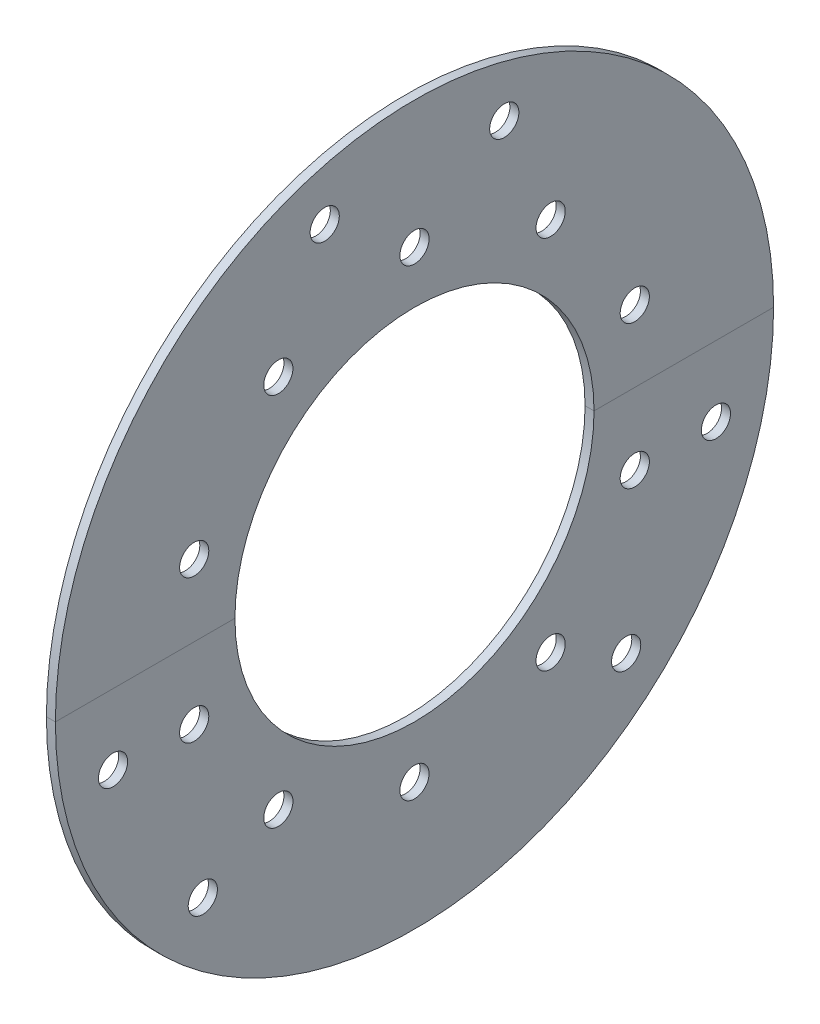
ISO-10303-21;
HEADER;
FILE_DESCRIPTION(('STEP AP214'),'2;1');
FILE_NAME('part.step','',(''),(''),'','','');
FILE_SCHEMA(('AUTOMOTIVE_DESIGN { 1 0 10303 214 1 1 1 1 }'));
ENDSEC;
DATA;
#1=APPLICATION_CONTEXT('core data for automotive mechanical design processes');
#2=APPLICATION_PROTOCOL_DEFINITION('international standard','automotive_design',2000,#1);
#3=PRODUCT_CONTEXT('',#1,'mechanical');
#4=PRODUCT('Part','Part','',(#3));
#5=PRODUCT_RELATED_PRODUCT_CATEGORY('part','',(#4));
#6=PRODUCT_DEFINITION_FORMATION('','',#4);
#7=PRODUCT_DEFINITION_CONTEXT('part definition',#1,'design');
#8=PRODUCT_DEFINITION('design','',#6,#7);
#9=PRODUCT_DEFINITION_SHAPE('','',#8);
#10=(LENGTH_UNIT() NAMED_UNIT(*) SI_UNIT(.MILLI.,.METRE.));
#11=(NAMED_UNIT(*) PLANE_ANGLE_UNIT() SI_UNIT($,.RADIAN.));
#12=(NAMED_UNIT(*) SI_UNIT($,.STERADIAN.) SOLID_ANGLE_UNIT());
#13=UNCERTAINTY_MEASURE_WITH_UNIT(LENGTH_MEASURE(1.E-05),#10,'distance_accuracy_value','');
#14=(GEOMETRIC_REPRESENTATION_CONTEXT(3) GLOBAL_UNCERTAINTY_ASSIGNED_CONTEXT((#13)) GLOBAL_UNIT_ASSIGNED_CONTEXT((#10,
#11,#12)) REPRESENTATION_CONTEXT('',''));
#15=CARTESIAN_POINT('',(0.,0.,0.));
#16=DIRECTION('',(0.,0.,1.));
#17=DIRECTION('',(1.,0.,0.));
#18=AXIS2_PLACEMENT_3D('',#15,#16,#17);
#19=CARTESIAN_POINT('',(0.,0.,0.));
#20=DIRECTION('',(0.,1.,0.));
#21=DIRECTION('',(0.,0.,1.));
#22=AXIS2_PLACEMENT_3D('',#19,#20,#21);
#23=PLANE('',#22);
#24=DIRECTION('',(0.,0.,1.));
#25=VECTOR('',#24,1.);
#26=CARTESIAN_POINT('',(2.,0.,0.));
#27=LINE('',#26,#25);
#28=CARTESIAN_POINT('',(2.,0.,-80.));
#29=VERTEX_POINT('',#28);
#30=CARTESIAN_POINT('',(2.,0.,-40.));
#31=VERTEX_POINT('',#30);
#32=EDGE_CURVE('E91',#29,#31,#27,.T.);
#33=ORIENTED_EDGE('',*,*,#32,.F.);
#34=DIRECTION('',(-1.,0.,0.));
#35=VECTOR('',#34,1.);
#36=CARTESIAN_POINT('',(2.,0.,-80.));
#37=LINE('',#36,#35);
#38=CARTESIAN_POINT('',(0.,0.,-80.));
#39=VERTEX_POINT('',#38);
#40=EDGE_CURVE('E100',#29,#39,#37,.T.);
#41=ORIENTED_EDGE('',*,*,#40,.T.);
#42=DIRECTION('',(0.,0.,1.));
#43=VECTOR('',#42,1.);
#44=CARTESIAN_POINT('',(0.,0.,0.));
#45=LINE('',#44,#43);
#46=CARTESIAN_POINT('',(0.,0.,-40.));
#47=VERTEX_POINT('',#46);
#48=EDGE_CURVE('E101',#39,#47,#45,.T.);
#49=ORIENTED_EDGE('',*,*,#48,.T.);
#50=DIRECTION('',(-1.,0.,0.));
#51=VECTOR('',#50,1.);
#52=CARTESIAN_POINT('',(2.,0.,-40.));
#53=LINE('',#52,#51);
#54=EDGE_CURVE('E61',#31,#47,#53,.T.);
#55=ORIENTED_EDGE('',*,*,#54,.F.);
#56=EDGE_LOOP('',(#33,#41,#49,#55));
#57=FACE_BOUND('',#56,.T.);
#58=ADVANCED_FACE('F44',(#57),#23,.T.);
#59=CARTESIAN_POINT('',(0.,0.,40.));
#60=VERTEX_POINT('',#59);
#61=CARTESIAN_POINT('',(0.,0.,80.));
#62=VERTEX_POINT('',#61);
#63=EDGE_CURVE('E105',#60,#62,#45,.T.);
#64=ORIENTED_EDGE('',*,*,#63,.T.);
#65=DIRECTION('',(-1.,0.,0.));
#66=VECTOR('',#65,1.);
#67=CARTESIAN_POINT('',(2.,0.,80.));
#68=LINE('',#67,#66);
#69=CARTESIAN_POINT('',(2.,0.,80.));
#70=VERTEX_POINT('',#69);
#71=EDGE_CURVE('E106',#62,#70,#68,.F.);
#72=ORIENTED_EDGE('',*,*,#71,.T.);
#73=CARTESIAN_POINT('',(2.,0.,40.));
#74=VERTEX_POINT('',#73);
#75=EDGE_CURVE('E92',#74,#70,#27,.T.);
#76=ORIENTED_EDGE('',*,*,#75,.F.);
#77=DIRECTION('',(-1.,0.,0.));
#78=VECTOR('',#77,1.);
#79=CARTESIAN_POINT('',(2.,0.,40.));
#80=LINE('',#79,#78);
#81=EDGE_CURVE('E69',#60,#74,#80,.F.);
#82=ORIENTED_EDGE('',*,*,#81,.F.);
#83=EDGE_LOOP('',(#64,#72,#76,#82));
#84=FACE_BOUND('',#83,.T.);
#85=ADVANCED_FACE('F172',(#84),#23,.T.);
#86=CARTESIAN_POINT('',(2.,-15.9452769097473,-49.0745162408299));
#87=DIRECTION('',(-1.,0.,0.));
#88=DIRECTION('',(0.,0.,1.));
#89=AXIS2_PLACEMENT_3D('',#86,#87,#88);
#90=CYLINDRICAL_SURFACE('',#89,3.25000000000001);
#91=CARTESIAN_POINT('',(2.,-15.9452769097473,-49.0745162408299));
#92=DIRECTION('',(1.,0.,0.));
#93=DIRECTION('',(0.,0.,-1.));
#94=AXIS2_PLACEMENT_3D('',#91,#92,#93);
#95=CIRCLE('',#94,3.25000000000001);
#96=CARTESIAN_POINT('',(2.,-15.9452769097473,-52.3245162408299));
#97=VERTEX_POINT('',#96);
#98=EDGE_CURVE('E114',#97,#97,#95,.T.);
#99=ORIENTED_EDGE('',*,*,#98,.T.);
#100=EDGE_LOOP('',(#99));
#101=FACE_BOUND('',#100,.T.);
#102=CARTESIAN_POINT('',(0.,-15.9452769097473,-49.0745162408299));
#103=DIRECTION('',(1.,0.,0.));
#104=DIRECTION('',(0.,0.,-1.));
#105=AXIS2_PLACEMENT_3D('',#102,#103,#104);
#106=CIRCLE('',#105,3.25000000000001);
#107=CARTESIAN_POINT('',(0.,-15.9452769097473,-52.3245162408299));
#108=VERTEX_POINT('',#107);
#109=EDGE_CURVE('E118',#108,#108,#106,.T.);
#110=ORIENTED_EDGE('',*,*,#109,.F.);
#111=EDGE_LOOP('',(#110));
#112=FACE_BOUND('',#111,.T.);
#113=ADVANCED_FACE('F174',(#101,#112),#90,.F.);
#114=CARTESIAN_POINT('',(2.,-41.7452769097473,-30.3297190182916));
#115=DIRECTION('',(-1.,0.,0.));
#116=DIRECTION('',(0.,0.,1.));
#117=AXIS2_PLACEMENT_3D('',#114,#115,#116);
#118=CYLINDRICAL_SURFACE('',#117,3.24999999999999);
#119=CARTESIAN_POINT('',(2.,-41.7452769097473,-30.3297190182916));
#120=DIRECTION('',(1.,0.,0.));
#121=DIRECTION('',(0.,0.,-1.));
#122=AXIS2_PLACEMENT_3D('',#119,#120,#121);
#123=CIRCLE('',#122,3.24999999999999);
#124=CARTESIAN_POINT('',(2.,-41.7452769097473,-33.5797190182916));
#125=VERTEX_POINT('',#124);
#126=EDGE_CURVE('E123',#125,#125,#123,.T.);
#127=ORIENTED_EDGE('',*,*,#126,.T.);
#128=EDGE_LOOP('',(#127));
#129=FACE_BOUND('',#128,.T.);
#130=CARTESIAN_POINT('',(0.,-41.7452769097473,-30.3297190182916));
#131=DIRECTION('',(1.,0.,0.));
#132=DIRECTION('',(0.,0.,-1.));
#133=AXIS2_PLACEMENT_3D('',#130,#131,#132);
#134=CIRCLE('',#133,3.24999999999999);
#135=CARTESIAN_POINT('',(0.,-41.7452769097473,-33.5797190182916));
#136=VERTEX_POINT('',#135);
#137=EDGE_CURVE('E126',#136,#136,#134,.T.);
#138=ORIENTED_EDGE('',*,*,#137,.F.);
#139=EDGE_LOOP('',(#138));
#140=FACE_BOUND('',#139,.T.);
#141=ADVANCED_FACE('F180',(#129,#140),#118,.F.);
#142=CARTESIAN_POINT('',(2.,-51.6,0.));
#143=DIRECTION('',(-1.,0.,0.));
#144=DIRECTION('',(0.,0.,1.));
#145=AXIS2_PLACEMENT_3D('',#142,#143,#144);
#146=CYLINDRICAL_SURFACE('',#145,3.25000000000001);
#147=CARTESIAN_POINT('',(2.,-51.6,0.));
#148=DIRECTION('',(1.,0.,0.));
#149=DIRECTION('',(0.,0.,-1.));
#150=AXIS2_PLACEMENT_3D('',#147,#148,#149);
#151=CIRCLE('',#150,3.25000000000001);
#152=CARTESIAN_POINT('',(2.,-51.6,-3.25000000000001));
#153=VERTEX_POINT('',#152);
#154=EDGE_CURVE('E129',#153,#153,#151,.T.);
#155=ORIENTED_EDGE('',*,*,#154,.T.);
#156=EDGE_LOOP('',(#155));
#157=FACE_BOUND('',#156,.T.);
#158=CARTESIAN_POINT('',(0.,-51.6,0.));
#159=DIRECTION('',(1.,0.,0.));
#160=DIRECTION('',(0.,0.,-1.));
#161=AXIS2_PLACEMENT_3D('',#158,#159,#160);
#162=CIRCLE('',#161,3.25000000000001);
#163=CARTESIAN_POINT('',(0.,-51.6,-3.25000000000001));
#164=VERTEX_POINT('',#163);
#165=EDGE_CURVE('E132',#164,#164,#162,.T.);
#166=ORIENTED_EDGE('',*,*,#165,.F.);
#167=EDGE_LOOP('',(#166));
#168=FACE_BOUND('',#167,.T.);
#169=ADVANCED_FACE('F249',(#157,#168),#146,.F.);
#170=CARTESIAN_POINT('',(2.,-41.7452769097473,30.3297190182916));
#171=DIRECTION('',(-1.,0.,0.));
#172=DIRECTION('',(0.,0.,1.));
#173=AXIS2_PLACEMENT_3D('',#170,#171,#172);
#174=CYLINDRICAL_SURFACE('',#173,3.25000000000001);
#175=CARTESIAN_POINT('',(2.,-41.7452769097473,30.3297190182916));
#176=DIRECTION('',(1.,0.,0.));
#177=DIRECTION('',(0.,0.,-1.));
#178=AXIS2_PLACEMENT_3D('',#175,#176,#177);
#179=CIRCLE('',#178,3.25000000000001);
#180=CARTESIAN_POINT('',(2.,-41.7452769097473,27.0797190182916));
#181=VERTEX_POINT('',#180);
#182=EDGE_CURVE('E135',#181,#181,#179,.T.);
#183=ORIENTED_EDGE('',*,*,#182,.T.);
#184=EDGE_LOOP('',(#183));
#185=FACE_BOUND('',#184,.T.);
#186=CARTESIAN_POINT('',(0.,-41.7452769097473,30.3297190182916));
#187=DIRECTION('',(1.,0.,0.));
#188=DIRECTION('',(0.,0.,-1.));
#189=AXIS2_PLACEMENT_3D('',#186,#187,#188);
#190=CIRCLE('',#189,3.25000000000001);
#191=CARTESIAN_POINT('',(0.,-41.7452769097473,27.0797190182916));
#192=VERTEX_POINT('',#191);
#193=EDGE_CURVE('E138',#192,#192,#190,.T.);
#194=ORIENTED_EDGE('',*,*,#193,.F.);
#195=EDGE_LOOP('',(#194));
#196=FACE_BOUND('',#195,.T.);
#197=ADVANCED_FACE('F241',(#185,#196),#174,.F.);
#198=CARTESIAN_POINT('',(2.,-15.9452769097473,49.0745162408299));
#199=DIRECTION('',(-1.,0.,0.));
#200=DIRECTION('',(0.,0.,1.));
#201=AXIS2_PLACEMENT_3D('',#198,#199,#200);
#202=CYLINDRICAL_SURFACE('',#201,3.25);
#203=CARTESIAN_POINT('',(2.,-15.9452769097473,49.0745162408299));
#204=DIRECTION('',(1.,0.,0.));
#205=DIRECTION('',(0.,0.,-1.));
#206=AXIS2_PLACEMENT_3D('',#203,#204,#205);
#207=CIRCLE('',#206,3.25);
#208=CARTESIAN_POINT('',(2.,-15.9452769097473,45.8245162408299));
#209=VERTEX_POINT('',#208);
#210=EDGE_CURVE('E141',#209,#209,#207,.T.);
#211=ORIENTED_EDGE('',*,*,#210,.T.);
#212=EDGE_LOOP('',(#211));
#213=FACE_BOUND('',#212,.T.);
#214=CARTESIAN_POINT('',(0.,-15.9452769097473,49.0745162408299));
#215=DIRECTION('',(1.,0.,0.));
#216=DIRECTION('',(0.,0.,-1.));
#217=AXIS2_PLACEMENT_3D('',#214,#215,#216);
#218=CIRCLE('',#217,3.25);
#219=CARTESIAN_POINT('',(0.,-15.9452769097473,45.8245162408299));
#220=VERTEX_POINT('',#219);
#221=EDGE_CURVE('E144',#220,#220,#218,.T.);
#222=ORIENTED_EDGE('',*,*,#221,.F.);
#223=EDGE_LOOP('',(#222));
#224=FACE_BOUND('',#223,.T.);
#225=ADVANCED_FACE('F233',(#213,#224),#202,.F.);
#226=CARTESIAN_POINT('',(2.,-15.6794919243112,-67.157676649773));
#227=DIRECTION('',(-1.,0.,0.));
#228=DIRECTION('',(0.,0.,1.));
#229=AXIS2_PLACEMENT_3D('',#226,#227,#228);
#230=CYLINDRICAL_SURFACE('',#229,3.25000000000001);
#231=CARTESIAN_POINT('',(2.,-15.6794919243112,-67.157676649773));
#232=DIRECTION('',(1.,0.,0.));
#233=DIRECTION('',(0.,0.,-1.));
#234=AXIS2_PLACEMENT_3D('',#231,#232,#233);
#235=CIRCLE('',#234,3.25000000000001);
#236=CARTESIAN_POINT('',(2.,-15.6794919243112,-70.407676649773));
#237=VERTEX_POINT('',#236);
#238=EDGE_CURVE('E147',#237,#237,#235,.T.);
#239=ORIENTED_EDGE('',*,*,#238,.T.);
#240=EDGE_LOOP('',(#239));
#241=FACE_BOUND('',#240,.T.);
#242=CARTESIAN_POINT('',(0.,-15.6794919243112,-67.157676649773));
#243=DIRECTION('',(1.,0.,0.));
#244=DIRECTION('',(0.,0.,-1.));
#245=AXIS2_PLACEMENT_3D('',#242,#243,#244);
#246=CIRCLE('',#245,3.25000000000001);
#247=CARTESIAN_POINT('',(0.,-15.6794919243112,-70.407676649773));
#248=VERTEX_POINT('',#247);
#249=EDGE_CURVE('E150',#248,#248,#246,.T.);
#250=ORIENTED_EDGE('',*,*,#249,.F.);
#251=EDGE_LOOP('',(#250));
#252=FACE_BOUND('',#251,.T.);
#253=ADVANCED_FACE('F225',(#241,#252),#230,.F.);
#254=CARTESIAN_POINT('',(2.,-50.3205080756888,-47.157676649773));
#255=DIRECTION('',(-1.,0.,0.));
#256=DIRECTION('',(0.,0.,1.));
#257=AXIS2_PLACEMENT_3D('',#254,#255,#256);
#258=CYLINDRICAL_SURFACE('',#257,3.25);
#259=CARTESIAN_POINT('',(2.,-50.3205080756888,-47.157676649773));
#260=DIRECTION('',(1.,0.,0.));
#261=DIRECTION('',(0.,0.,-1.));
#262=AXIS2_PLACEMENT_3D('',#259,#260,#261);
#263=CIRCLE('',#262,3.25);
#264=CARTESIAN_POINT('',(2.,-50.3205080756888,-50.407676649773));
#265=VERTEX_POINT('',#264);
#266=EDGE_CURVE('E153',#265,#265,#263,.T.);
#267=ORIENTED_EDGE('',*,*,#266,.T.);
#268=EDGE_LOOP('',(#267));
#269=FACE_BOUND('',#268,.T.);
#270=CARTESIAN_POINT('',(0.,-50.3205080756888,-47.157676649773));
#271=DIRECTION('',(1.,0.,0.));
#272=DIRECTION('',(0.,0.,-1.));
#273=AXIS2_PLACEMENT_3D('',#270,#271,#272);
#274=CIRCLE('',#273,3.25);
#275=CARTESIAN_POINT('',(0.,-50.3205080756888,-50.407676649773));
#276=VERTEX_POINT('',#275);
#277=EDGE_CURVE('E156',#276,#276,#274,.T.);
#278=ORIENTED_EDGE('',*,*,#277,.F.);
#279=EDGE_LOOP('',(#278));
#280=FACE_BOUND('',#279,.T.);
#281=ADVANCED_FACE('F218',(#269,#280),#258,.F.);
#282=CARTESIAN_POINT('',(2.,-50.3205080756888,47.1576766497729));
#283=DIRECTION('',(-1.,0.,0.));
#284=DIRECTION('',(0.,0.,1.));
#285=AXIS2_PLACEMENT_3D('',#282,#283,#284);
#286=CYLINDRICAL_SURFACE('',#285,3.25);
#287=CARTESIAN_POINT('',(2.,-50.3205080756888,47.1576766497729));
#288=DIRECTION('',(1.,0.,0.));
#289=DIRECTION('',(0.,0.,-1.));
#290=AXIS2_PLACEMENT_3D('',#287,#288,#289);
#291=CIRCLE('',#290,3.25);
#292=CARTESIAN_POINT('',(2.,-50.3205080756888,43.9076766497729));
#293=VERTEX_POINT('',#292);
#294=EDGE_CURVE('E159',#293,#293,#291,.T.);
#295=ORIENTED_EDGE('',*,*,#294,.T.);
#296=EDGE_LOOP('',(#295));
#297=FACE_BOUND('',#296,.T.);
#298=CARTESIAN_POINT('',(0.,-50.3205080756888,47.1576766497729));
#299=DIRECTION('',(1.,0.,0.));
#300=DIRECTION('',(0.,0.,-1.));
#301=AXIS2_PLACEMENT_3D('',#298,#299,#300);
#302=CIRCLE('',#301,3.25);
#303=CARTESIAN_POINT('',(0.,-50.3205080756888,43.9076766497729));
#304=VERTEX_POINT('',#303);
#305=EDGE_CURVE('E162',#304,#304,#302,.T.);
#306=ORIENTED_EDGE('',*,*,#305,.F.);
#307=EDGE_LOOP('',(#306));
#308=FACE_BOUND('',#307,.T.);
#309=ADVANCED_FACE('F211',(#297,#308),#286,.F.);
#310=CARTESIAN_POINT('',(2.,-15.6794919243113,67.157676649773));
#311=DIRECTION('',(-1.,0.,0.));
#312=DIRECTION('',(0.,0.,1.));
#313=AXIS2_PLACEMENT_3D('',#310,#311,#312);
#314=CYLINDRICAL_SURFACE('',#313,3.25000000000001);
#315=CARTESIAN_POINT('',(2.,-15.6794919243113,67.157676649773));
#316=DIRECTION('',(1.,0.,0.));
#317=DIRECTION('',(0.,0.,-1.));
#318=AXIS2_PLACEMENT_3D('',#315,#316,#317);
#319=CIRCLE('',#318,3.25000000000001);
#320=CARTESIAN_POINT('',(2.,-15.6794919243113,63.907676649773));
#321=VERTEX_POINT('',#320);
#322=EDGE_CURVE('E53',#321,#321,#319,.T.);
#323=ORIENTED_EDGE('',*,*,#322,.T.);
#324=EDGE_LOOP('',(#323));
#325=FACE_BOUND('',#324,.T.);
#326=CARTESIAN_POINT('',(0.,-15.6794919243113,67.157676649773));
#327=DIRECTION('',(1.,0.,0.));
#328=DIRECTION('',(0.,0.,-1.));
#329=AXIS2_PLACEMENT_3D('',#326,#327,#328);
#330=CIRCLE('',#329,3.25000000000001);
#331=CARTESIAN_POINT('',(0.,-15.6794919243113,63.907676649773));
#332=VERTEX_POINT('',#331);
#333=EDGE_CURVE('E12',#332,#332,#330,.T.);
#334=ORIENTED_EDGE('',*,*,#333,.F.);
#335=EDGE_LOOP('',(#334));
#336=FACE_BOUND('',#335,.T.);
#337=ADVANCED_FACE('F184',(#325,#336),#314,.F.);
#338=CARTESIAN_POINT('',(0.,0.,0.));
#339=DIRECTION('',(1.,0.,0.));
#340=DIRECTION('',(0.,0.,-1.));
#341=AXIS2_PLACEMENT_3D('',#338,#339,#340);
#342=PLANE('',#341);
#343=ORIENTED_EDGE('',*,*,#333,.T.);
#344=EDGE_LOOP('',(#343));
#345=FACE_BOUND('',#344,.T.);
#346=ORIENTED_EDGE('',*,*,#305,.T.);
#347=EDGE_LOOP('',(#346));
#348=FACE_BOUND('',#347,.T.);
#349=ORIENTED_EDGE('',*,*,#277,.T.);
#350=EDGE_LOOP('',(#349));
#351=FACE_BOUND('',#350,.T.);
#352=ORIENTED_EDGE('',*,*,#249,.T.);
#353=EDGE_LOOP('',(#352));
#354=FACE_BOUND('',#353,.T.);
#355=ORIENTED_EDGE('',*,*,#221,.T.);
#356=EDGE_LOOP('',(#355));
#357=FACE_BOUND('',#356,.T.);
#358=ORIENTED_EDGE('',*,*,#193,.T.);
#359=EDGE_LOOP('',(#358));
#360=FACE_BOUND('',#359,.T.);
#361=ORIENTED_EDGE('',*,*,#165,.T.);
#362=EDGE_LOOP('',(#361));
#363=FACE_BOUND('',#362,.T.);
#364=ORIENTED_EDGE('',*,*,#137,.T.);
#365=EDGE_LOOP('',(#364));
#366=FACE_BOUND('',#365,.T.);
#367=ORIENTED_EDGE('',*,*,#109,.T.);
#368=EDGE_LOOP('',(#367));
#369=FACE_BOUND('',#368,.T.);
#370=ORIENTED_EDGE('',*,*,#48,.F.);
#371=CARTESIAN_POINT('',(0.,0.,0.));
#372=DIRECTION('',(1.,0.,0.));
#373=DIRECTION('',(0.,0.,-1.));
#374=AXIS2_PLACEMENT_3D('',#371,#372,#373);
#375=CIRCLE('',#374,80.);
#376=EDGE_CURVE('E97',#62,#39,#375,.T.);
#377=ORIENTED_EDGE('',*,*,#376,.F.);
#378=ORIENTED_EDGE('',*,*,#63,.F.);
#379=CARTESIAN_POINT('',(0.,0.,0.));
#380=DIRECTION('',(1.,0.,0.));
#381=DIRECTION('',(0.,0.,-1.));
#382=AXIS2_PLACEMENT_3D('',#379,#380,#381);
#383=CIRCLE('',#382,40.);
#384=EDGE_CURVE('E48',#60,#47,#383,.T.);
#385=ORIENTED_EDGE('',*,*,#384,.T.);
#386=EDGE_LOOP('',(#370,#377,#378,#385));
#387=FACE_BOUND('',#386,.T.);
#388=ADVANCED_FACE('F170',(#345,#348,#351,#354,#357,#360,#363,#366,#369,#387),#342,.F.);
#389=CARTESIAN_POINT('',(2.,0.,0.));
#390=DIRECTION('',(1.,0.,0.));
#391=DIRECTION('',(0.,0.,-1.));
#392=AXIS2_PLACEMENT_3D('',#389,#390,#391);
#393=PLANE('',#392);
#394=ORIENTED_EDGE('',*,*,#322,.F.);
#395=EDGE_LOOP('',(#394));
#396=FACE_BOUND('',#395,.T.);
#397=ORIENTED_EDGE('',*,*,#266,.F.);
#398=EDGE_LOOP('',(#397));
#399=FACE_BOUND('',#398,.T.);
#400=ORIENTED_EDGE('',*,*,#210,.F.);
#401=EDGE_LOOP('',(#400));
#402=FACE_BOUND('',#401,.T.);
#403=ORIENTED_EDGE('',*,*,#154,.F.);
#404=EDGE_LOOP('',(#403));
#405=FACE_BOUND('',#404,.T.);
#406=ORIENTED_EDGE('',*,*,#98,.F.);
#407=EDGE_LOOP('',(#406));
#408=FACE_BOUND('',#407,.T.);
#409=ORIENTED_EDGE('',*,*,#126,.F.);
#410=EDGE_LOOP('',(#409));
#411=FACE_BOUND('',#410,.T.);
#412=ORIENTED_EDGE('',*,*,#182,.F.);
#413=EDGE_LOOP('',(#412));
#414=FACE_BOUND('',#413,.T.);
#415=ORIENTED_EDGE('',*,*,#238,.F.);
#416=EDGE_LOOP('',(#415));
#417=FACE_BOUND('',#416,.T.);
#418=ORIENTED_EDGE('',*,*,#294,.F.);
#419=EDGE_LOOP('',(#418));
#420=FACE_BOUND('',#419,.T.);
#421=CARTESIAN_POINT('',(2.,0.,0.));
#422=DIRECTION('',(1.,0.,0.));
#423=DIRECTION('',(0.,0.,-1.));
#424=AXIS2_PLACEMENT_3D('',#421,#422,#423);
#425=CIRCLE('',#424,80.);
#426=EDGE_CURVE('E88',#70,#29,#425,.T.);
#427=ORIENTED_EDGE('',*,*,#426,.T.);
#428=ORIENTED_EDGE('',*,*,#32,.T.);
#429=CARTESIAN_POINT('',(2.,0.,0.));
#430=DIRECTION('',(1.,0.,0.));
#431=DIRECTION('',(0.,0.,-1.));
#432=AXIS2_PLACEMENT_3D('',#429,#430,#431);
#433=CIRCLE('',#432,40.);
#434=EDGE_CURVE('E112',#74,#31,#433,.T.);
#435=ORIENTED_EDGE('',*,*,#434,.F.);
#436=ORIENTED_EDGE('',*,*,#75,.T.);
#437=EDGE_LOOP('',(#427,#428,#435,#436));
#438=FACE_BOUND('',#437,.T.);
#439=ADVANCED_FACE('F89',(#396,#399,#402,#405,#408,#411,#414,#417,#420,#438),#393,.T.);
#440=CARTESIAN_POINT('',(2.,0.,0.));
#441=DIRECTION('',(-1.,0.,0.));
#442=DIRECTION('',(0.,0.,1.));
#443=AXIS2_PLACEMENT_3D('',#440,#441,#442);
#444=CYLINDRICAL_SURFACE('',#443,40.);
#445=ORIENTED_EDGE('',*,*,#434,.T.);
#446=ORIENTED_EDGE('',*,*,#54,.T.);
#447=ORIENTED_EDGE('',*,*,#384,.F.);
#448=ORIENTED_EDGE('',*,*,#81,.T.);
#449=EDGE_LOOP('',(#445,#446,#447,#448));
#450=FACE_BOUND('',#449,.T.);
#451=ADVANCED_FACE('F46',(#450),#444,.F.);
#452=CARTESIAN_POINT('',(2.,0.,0.));
#453=DIRECTION('',(-1.,0.,0.));
#454=DIRECTION('',(0.,0.,1.));
#455=AXIS2_PLACEMENT_3D('',#452,#453,#454);
#456=CYLINDRICAL_SURFACE('',#455,80.);
#457=ORIENTED_EDGE('',*,*,#40,.F.);
#458=ORIENTED_EDGE('',*,*,#426,.F.);
#459=ORIENTED_EDGE('',*,*,#71,.F.);
#460=ORIENTED_EDGE('',*,*,#376,.T.);
#461=EDGE_LOOP('',(#457,#458,#459,#460));
#462=FACE_BOUND('',#461,.T.);
#463=ADVANCED_FACE('F103',(#462),#456,.T.);
#464=CLOSED_SHELL('',(#58,#85,#113,#141,#169,#197,#225,#253,#281,#309,#337,#388,#439,#451,#463));
#465=MANIFOLD_SOLID_BREP('B2',#464);
#466=CARTESIAN_POINT('',(0.,0.,0.));
#467=DIRECTION('',(0.,1.,0.));
#468=DIRECTION('',(0.,0.,1.));
#469=AXIS2_PLACEMENT_3D('',#466,#467,#468);
#470=PLANE('',#469);
#471=DIRECTION('',(0.,0.,1.));
#472=VECTOR('',#471,1.);
#473=CARTESIAN_POINT('',(2.,0.,0.));
#474=LINE('',#473,#472);
#475=CARTESIAN_POINT('',(2.,0.,-80.));
#476=VERTEX_POINT('',#475);
#477=CARTESIAN_POINT('',(2.,0.,-40.));
#478=VERTEX_POINT('',#477);
#479=EDGE_CURVE('E397',#476,#478,#474,.T.);
#480=ORIENTED_EDGE('',*,*,#479,.T.);
#481=DIRECTION('',(-1.,0.,0.));
#482=VECTOR('',#481,1.);
#483=CARTESIAN_POINT('',(2.,0.,-40.));
#484=LINE('',#483,#482);
#485=CARTESIAN_POINT('',(0.,0.,-40.));
#486=VERTEX_POINT('',#485);
#487=EDGE_CURVE('E361',#478,#486,#484,.T.);
#488=ORIENTED_EDGE('',*,*,#487,.T.);
#489=DIRECTION('',(0.,0.,1.));
#490=VECTOR('',#489,1.);
#491=CARTESIAN_POINT('',(0.,0.,0.));
#492=LINE('',#491,#490);
#493=CARTESIAN_POINT('',(0.,0.,-80.));
#494=VERTEX_POINT('',#493);
#495=EDGE_CURVE('E398',#494,#486,#492,.T.);
#496=ORIENTED_EDGE('',*,*,#495,.F.);
#497=DIRECTION('',(-1.,0.,0.));
#498=VECTOR('',#497,1.);
#499=CARTESIAN_POINT('',(2.,0.,-80.));
#500=LINE('',#499,#498);
#501=EDGE_CURVE('E356',#476,#494,#500,.T.);
#502=ORIENTED_EDGE('',*,*,#501,.F.);
#503=EDGE_LOOP('',(#480,#488,#496,#502));
#504=FACE_BOUND('',#503,.T.);
#505=ADVANCED_FACE('F353',(#504),#470,.F.);
#506=CARTESIAN_POINT('',(0.,0.,40.));
#507=VERTEX_POINT('',#506);
#508=CARTESIAN_POINT('',(0.,0.,80.));
#509=VERTEX_POINT('',#508);
#510=EDGE_CURVE('E403',#507,#509,#492,.T.);
#511=ORIENTED_EDGE('',*,*,#510,.F.);
#512=DIRECTION('',(-1.,0.,0.));
#513=VECTOR('',#512,1.);
#514=CARTESIAN_POINT('',(2.,0.,40.));
#515=LINE('',#514,#513);
#516=CARTESIAN_POINT('',(2.,0.,40.));
#517=VERTEX_POINT('',#516);
#518=EDGE_CURVE('E42',#507,#517,#515,.F.);
#519=ORIENTED_EDGE('',*,*,#518,.T.);
#520=CARTESIAN_POINT('',(2.,0.,80.));
#521=VERTEX_POINT('',#520);
#522=EDGE_CURVE('E376',#517,#521,#474,.T.);
#523=ORIENTED_EDGE('',*,*,#522,.T.);
#524=DIRECTION('',(-1.,0.,0.));
#525=VECTOR('',#524,1.);
#526=CARTESIAN_POINT('',(2.,0.,80.));
#527=LINE('',#526,#525);
#528=EDGE_CURVE('E404',#509,#521,#527,.F.);
#529=ORIENTED_EDGE('',*,*,#528,.F.);
#530=EDGE_LOOP('',(#511,#519,#523,#529));
#531=FACE_BOUND('',#530,.T.);
#532=ADVANCED_FACE('F421',(#531),#470,.F.);
#533=CARTESIAN_POINT('',(2.,0.,0.));
#534=DIRECTION('',(1.,0.,0.));
#535=DIRECTION('',(0.,0.,-1.));
#536=AXIS2_PLACEMENT_3D('',#533,#534,#535);
#537=PLANE('',#536);
#538=ORIENTED_EDGE('',*,*,#479,.F.);
#539=CARTESIAN_POINT('',(2.,0.,0.));
#540=DIRECTION('',(1.,0.,0.));
#541=DIRECTION('',(0.,0.,-1.));
#542=AXIS2_PLACEMENT_3D('',#539,#540,#541);
#543=CIRCLE('',#542,80.);
#544=EDGE_CURVE('E407',#476,#521,#543,.T.);
#545=ORIENTED_EDGE('',*,*,#544,.T.);
#546=ORIENTED_EDGE('',*,*,#522,.F.);
#547=CARTESIAN_POINT('',(2.,0.,0.));
#548=DIRECTION('',(1.,0.,0.));
#549=DIRECTION('',(0.,0.,-1.));
#550=AXIS2_PLACEMENT_3D('',#547,#548,#549);
#551=CIRCLE('',#550,40.);
#552=EDGE_CURVE('E408',#478,#517,#551,.T.);
#553=ORIENTED_EDGE('',*,*,#552,.F.);
#554=EDGE_LOOP('',(#538,#545,#546,#553));
#555=FACE_BOUND('',#554,.T.);
#556=CARTESIAN_POINT('',(2.,66.,20.));
#557=DIRECTION('',(1.,0.,0.));
#558=DIRECTION('',(0.,0.,-1.));
#559=AXIS2_PLACEMENT_3D('',#556,#557,#558);
#560=CIRCLE('',#559,3.25);
#561=CARTESIAN_POINT('',(2.,66.,16.75));
#562=VERTEX_POINT('',#561);
#563=EDGE_CURVE('E454',#562,#562,#560,.T.);
#564=ORIENTED_EDGE('',*,*,#563,.F.);
#565=EDGE_LOOP('',(#564));
#566=FACE_BOUND('',#565,.T.);
#567=CARTESIAN_POINT('',(2.,15.9452769097473,49.0745162408299));
#568=DIRECTION('',(1.,0.,0.));
#569=DIRECTION('',(0.,0.,-1.));
#570=AXIS2_PLACEMENT_3D('',#567,#568,#569);
#571=CIRCLE('',#570,3.25);
#572=CARTESIAN_POINT('',(2.,15.9452769097473,45.8245162408299));
#573=VERTEX_POINT('',#572);
#574=EDGE_CURVE('E442',#573,#573,#571,.T.);
#575=ORIENTED_EDGE('',*,*,#574,.F.);
#576=EDGE_LOOP('',(#575));
#577=FACE_BOUND('',#576,.T.);
#578=CARTESIAN_POINT('',(2.,15.9452769097473,-49.0745162408299));
#579=DIRECTION('',(1.,0.,0.));
#580=DIRECTION('',(0.,0.,-1.));
#581=AXIS2_PLACEMENT_3D('',#578,#579,#580);
#582=CIRCLE('',#581,3.25);
#583=CARTESIAN_POINT('',(2.,15.9452769097473,-52.3245162408299));
#584=VERTEX_POINT('',#583);
#585=EDGE_CURVE('E436',#584,#584,#582,.T.);
#586=ORIENTED_EDGE('',*,*,#585,.F.);
#587=EDGE_LOOP('',(#586));
#588=FACE_BOUND('',#587,.T.);
#589=CARTESIAN_POINT('',(2.,51.6,0.));
#590=DIRECTION('',(1.,0.,0.));
#591=DIRECTION('',(0.,0.,-1.));
#592=AXIS2_PLACEMENT_3D('',#589,#590,#591);
#593=CIRCLE('',#592,3.25);
#594=CARTESIAN_POINT('',(2.,51.6,-3.25));
#595=VERTEX_POINT('',#594);
#596=EDGE_CURVE('E425',#595,#595,#593,.T.);
#597=ORIENTED_EDGE('',*,*,#596,.F.);
#598=EDGE_LOOP('',(#597));
#599=FACE_BOUND('',#598,.T.);
#600=CARTESIAN_POINT('',(2.,41.7452769097473,-30.3297190182916));
#601=DIRECTION('',(1.,0.,0.));
#602=DIRECTION('',(0.,0.,-1.));
#603=AXIS2_PLACEMENT_3D('',#600,#601,#602);
#604=CIRCLE('',#603,3.25000000000001);
#605=CARTESIAN_POINT('',(2.,41.7452769097473,-33.5797190182916));
#606=VERTEX_POINT('',#605);
#607=EDGE_CURVE('E430',#606,#606,#604,.T.);
#608=ORIENTED_EDGE('',*,*,#607,.F.);
#609=EDGE_LOOP('',(#608));
#610=FACE_BOUND('',#609,.T.);
#611=CARTESIAN_POINT('',(2.,41.7452769097473,30.3297190182916));
#612=DIRECTION('',(1.,0.,0.));
#613=DIRECTION('',(0.,0.,-1.));
#614=AXIS2_PLACEMENT_3D('',#611,#612,#613);
#615=CIRCLE('',#614,3.25);
#616=CARTESIAN_POINT('',(2.,41.7452769097473,27.0797190182916));
#617=VERTEX_POINT('',#616);
#618=EDGE_CURVE('E448',#617,#617,#615,.T.);
#619=ORIENTED_EDGE('',*,*,#618,.F.);
#620=EDGE_LOOP('',(#619));
#621=FACE_BOUND('',#620,.T.);
#622=CARTESIAN_POINT('',(2.,66.,-20.));
#623=DIRECTION('',(1.,0.,0.));
#624=DIRECTION('',(0.,0.,-1.));
#625=AXIS2_PLACEMENT_3D('',#622,#623,#624);
#626=CIRCLE('',#625,3.25);
#627=CARTESIAN_POINT('',(2.,66.,-23.25));
#628=VERTEX_POINT('',#627);
#629=EDGE_CURVE('E460',#628,#628,#626,.T.);
#630=ORIENTED_EDGE('',*,*,#629,.F.);
#631=EDGE_LOOP('',(#630));
#632=FACE_BOUND('',#631,.T.);
#633=ADVANCED_FACE('F405',(#555,#566,#577,#588,#599,#610,#621,#632),#537,.T.);
#634=CARTESIAN_POINT('',(0.,0.,0.));
#635=DIRECTION('',(1.,0.,0.));
#636=DIRECTION('',(0.,0.,-1.));
#637=AXIS2_PLACEMENT_3D('',#634,#635,#636);
#638=PLANE('',#637);
#639=CARTESIAN_POINT('',(0.,0.,0.));
#640=DIRECTION('',(1.,0.,0.));
#641=DIRECTION('',(0.,0.,-1.));
#642=AXIS2_PLACEMENT_3D('',#639,#640,#641);
#643=CIRCLE('',#642,80.);
#644=EDGE_CURVE('E411',#494,#509,#643,.T.);
#645=ORIENTED_EDGE('',*,*,#644,.F.);
#646=ORIENTED_EDGE('',*,*,#495,.T.);
#647=CARTESIAN_POINT('',(0.,0.,0.));
#648=DIRECTION('',(1.,0.,0.));
#649=DIRECTION('',(0.,0.,-1.));
#650=AXIS2_PLACEMENT_3D('',#647,#648,#649);
#651=CIRCLE('',#650,40.);
#652=EDGE_CURVE('E415',#486,#507,#651,.T.);
#653=ORIENTED_EDGE('',*,*,#652,.T.);
#654=ORIENTED_EDGE('',*,*,#510,.T.);
#655=EDGE_LOOP('',(#645,#646,#653,#654));
#656=FACE_BOUND('',#655,.T.);
#657=CARTESIAN_POINT('',(0.,51.6,0.));
#658=DIRECTION('',(1.,0.,0.));
#659=DIRECTION('',(0.,0.,-1.));
#660=AXIS2_PLACEMENT_3D('',#657,#658,#659);
#661=CIRCLE('',#660,3.25);
#662=CARTESIAN_POINT('',(0.,51.6,-3.25));
#663=VERTEX_POINT('',#662);
#664=EDGE_CURVE('E427',#663,#663,#661,.T.);
#665=ORIENTED_EDGE('',*,*,#664,.T.);
#666=EDGE_LOOP('',(#665));
#667=FACE_BOUND('',#666,.T.);
#668=CARTESIAN_POINT('',(0.,41.7452769097473,-30.3297190182916));
#669=DIRECTION('',(1.,0.,0.));
#670=DIRECTION('',(0.,0.,-1.));
#671=AXIS2_PLACEMENT_3D('',#668,#669,#670);
#672=CIRCLE('',#671,3.25000000000001);
#673=CARTESIAN_POINT('',(0.,41.7452769097473,-33.5797190182916));
#674=VERTEX_POINT('',#673);
#675=EDGE_CURVE('E433',#674,#674,#672,.T.);
#676=ORIENTED_EDGE('',*,*,#675,.T.);
#677=EDGE_LOOP('',(#676));
#678=FACE_BOUND('',#677,.T.);
#679=CARTESIAN_POINT('',(0.,15.9452769097473,-49.0745162408299));
#680=DIRECTION('',(1.,0.,0.));
#681=DIRECTION('',(0.,0.,-1.));
#682=AXIS2_PLACEMENT_3D('',#679,#680,#681);
#683=CIRCLE('',#682,3.25);
#684=CARTESIAN_POINT('',(0.,15.9452769097473,-52.3245162408299));
#685=VERTEX_POINT('',#684);
#686=EDGE_CURVE('E439',#685,#685,#683,.T.);
#687=ORIENTED_EDGE('',*,*,#686,.T.);
#688=EDGE_LOOP('',(#687));
#689=FACE_BOUND('',#688,.T.);
#690=CARTESIAN_POINT('',(0.,15.9452769097473,49.0745162408299));
#691=DIRECTION('',(1.,0.,0.));
#692=DIRECTION('',(0.,0.,-1.));
#693=AXIS2_PLACEMENT_3D('',#690,#691,#692);
#694=CIRCLE('',#693,3.25);
#695=CARTESIAN_POINT('',(0.,15.9452769097473,45.8245162408299));
#696=VERTEX_POINT('',#695);
#697=EDGE_CURVE('E445',#696,#696,#694,.T.);
#698=ORIENTED_EDGE('',*,*,#697,.T.);
#699=EDGE_LOOP('',(#698));
#700=FACE_BOUND('',#699,.T.);
#701=CARTESIAN_POINT('',(0.,41.7452769097473,30.3297190182916));
#702=DIRECTION('',(1.,0.,0.));
#703=DIRECTION('',(0.,0.,-1.));
#704=AXIS2_PLACEMENT_3D('',#701,#702,#703);
#705=CIRCLE('',#704,3.25);
#706=CARTESIAN_POINT('',(0.,41.7452769097473,27.0797190182916));
#707=VERTEX_POINT('',#706);
#708=EDGE_CURVE('E451',#707,#707,#705,.T.);
#709=ORIENTED_EDGE('',*,*,#708,.T.);
#710=EDGE_LOOP('',(#709));
#711=FACE_BOUND('',#710,.T.);
#712=CARTESIAN_POINT('',(0.,66.,20.));
#713=DIRECTION('',(1.,0.,0.));
#714=DIRECTION('',(0.,0.,-1.));
#715=AXIS2_PLACEMENT_3D('',#712,#713,#714);
#716=CIRCLE('',#715,3.25);
#717=CARTESIAN_POINT('',(0.,66.,16.75));
#718=VERTEX_POINT('',#717);
#719=EDGE_CURVE('E457',#718,#718,#716,.T.);
#720=ORIENTED_EDGE('',*,*,#719,.T.);
#721=EDGE_LOOP('',(#720));
#722=FACE_BOUND('',#721,.T.);
#723=CARTESIAN_POINT('',(0.,66.,-20.));
#724=DIRECTION('',(1.,0.,0.));
#725=DIRECTION('',(0.,0.,-1.));
#726=AXIS2_PLACEMENT_3D('',#723,#724,#725);
#727=CIRCLE('',#726,3.25);
#728=CARTESIAN_POINT('',(0.,66.,-23.25));
#729=VERTEX_POINT('',#728);
#730=EDGE_CURVE('E463',#729,#729,#727,.T.);
#731=ORIENTED_EDGE('',*,*,#730,.T.);
#732=EDGE_LOOP('',(#731));
#733=FACE_BOUND('',#732,.T.);
#734=ADVANCED_FACE('F473',(#656,#667,#678,#689,#700,#711,#722,#733),#638,.F.);
#735=CARTESIAN_POINT('',(2.,0.,0.));
#736=DIRECTION('',(-1.,0.,0.));
#737=DIRECTION('',(0.,0.,1.));
#738=AXIS2_PLACEMENT_3D('',#735,#736,#737);
#739=CYLINDRICAL_SURFACE('',#738,80.);
#740=ORIENTED_EDGE('',*,*,#544,.F.);
#741=ORIENTED_EDGE('',*,*,#501,.T.);
#742=ORIENTED_EDGE('',*,*,#644,.T.);
#743=ORIENTED_EDGE('',*,*,#528,.T.);
#744=EDGE_LOOP('',(#740,#741,#742,#743));
#745=FACE_BOUND('',#744,.T.);
#746=ADVANCED_FACE('F410',(#745),#739,.T.);
#747=CARTESIAN_POINT('',(2.,0.,0.));
#748=DIRECTION('',(-1.,0.,0.));
#749=DIRECTION('',(0.,0.,1.));
#750=AXIS2_PLACEMENT_3D('',#747,#748,#749);
#751=CYLINDRICAL_SURFACE('',#750,40.);
#752=ORIENTED_EDGE('',*,*,#487,.F.);
#753=ORIENTED_EDGE('',*,*,#552,.T.);
#754=ORIENTED_EDGE('',*,*,#518,.F.);
#755=ORIENTED_EDGE('',*,*,#652,.F.);
#756=EDGE_LOOP('',(#752,#753,#754,#755));
#757=FACE_BOUND('',#756,.T.);
#758=ADVANCED_FACE('F424',(#757),#751,.F.);
#759=CARTESIAN_POINT('',(2.,51.6,0.));
#760=DIRECTION('',(-1.,0.,0.));
#761=DIRECTION('',(0.,0.,1.));
#762=AXIS2_PLACEMENT_3D('',#759,#760,#761);
#763=CYLINDRICAL_SURFACE('',#762,3.25);
#764=ORIENTED_EDGE('',*,*,#596,.T.);
#765=EDGE_LOOP('',(#764));
#766=FACE_BOUND('',#765,.T.);
#767=ORIENTED_EDGE('',*,*,#664,.F.);
#768=EDGE_LOOP('',(#767));
#769=FACE_BOUND('',#768,.T.);
#770=ADVANCED_FACE('F516',(#766,#769),#763,.F.);
#771=CARTESIAN_POINT('',(2.,41.7452769097473,-30.3297190182916));
#772=DIRECTION('',(-1.,0.,0.));
#773=DIRECTION('',(0.,0.,1.));
#774=AXIS2_PLACEMENT_3D('',#771,#772,#773);
#775=CYLINDRICAL_SURFACE('',#774,3.25000000000001);
#776=ORIENTED_EDGE('',*,*,#607,.T.);
#777=EDGE_LOOP('',(#776));
#778=FACE_BOUND('',#777,.T.);
#779=ORIENTED_EDGE('',*,*,#675,.F.);
#780=EDGE_LOOP('',(#779));
#781=FACE_BOUND('',#780,.T.);
#782=ADVANCED_FACE('F524',(#778,#781),#775,.F.);
#783=CARTESIAN_POINT('',(2.,15.9452769097473,-49.0745162408299));
#784=DIRECTION('',(-1.,0.,0.));
#785=DIRECTION('',(0.,0.,1.));
#786=AXIS2_PLACEMENT_3D('',#783,#784,#785);
#787=CYLINDRICAL_SURFACE('',#786,3.25);
#788=ORIENTED_EDGE('',*,*,#585,.T.);
#789=EDGE_LOOP('',(#788));
#790=FACE_BOUND('',#789,.T.);
#791=ORIENTED_EDGE('',*,*,#686,.F.);
#792=EDGE_LOOP('',(#791));
#793=FACE_BOUND('',#792,.T.);
#794=ADVANCED_FACE('F533',(#790,#793),#787,.F.);
#795=CARTESIAN_POINT('',(2.,15.9452769097473,49.0745162408299));
#796=DIRECTION('',(-1.,0.,0.));
#797=DIRECTION('',(0.,0.,1.));
#798=AXIS2_PLACEMENT_3D('',#795,#796,#797);
#799=CYLINDRICAL_SURFACE('',#798,3.25);
#800=ORIENTED_EDGE('',*,*,#574,.T.);
#801=EDGE_LOOP('',(#800));
#802=FACE_BOUND('',#801,.T.);
#803=ORIENTED_EDGE('',*,*,#697,.F.);
#804=EDGE_LOOP('',(#803));
#805=FACE_BOUND('',#804,.T.);
#806=ADVANCED_FACE('F542',(#802,#805),#799,.F.);
#807=CARTESIAN_POINT('',(2.,41.7452769097473,30.3297190182916));
#808=DIRECTION('',(-1.,0.,0.));
#809=DIRECTION('',(0.,0.,1.));
#810=AXIS2_PLACEMENT_3D('',#807,#808,#809);
#811=CYLINDRICAL_SURFACE('',#810,3.25);
#812=ORIENTED_EDGE('',*,*,#618,.T.);
#813=EDGE_LOOP('',(#812));
#814=FACE_BOUND('',#813,.T.);
#815=ORIENTED_EDGE('',*,*,#708,.F.);
#816=EDGE_LOOP('',(#815));
#817=FACE_BOUND('',#816,.T.);
#818=ADVANCED_FACE('F551',(#814,#817),#811,.F.);
#819=CARTESIAN_POINT('',(2.,66.,20.));
#820=DIRECTION('',(-1.,0.,0.));
#821=DIRECTION('',(0.,0.,1.));
#822=AXIS2_PLACEMENT_3D('',#819,#820,#821);
#823=CYLINDRICAL_SURFACE('',#822,3.25);
#824=ORIENTED_EDGE('',*,*,#563,.T.);
#825=EDGE_LOOP('',(#824));
#826=FACE_BOUND('',#825,.T.);
#827=ORIENTED_EDGE('',*,*,#719,.F.);
#828=EDGE_LOOP('',(#827));
#829=FACE_BOUND('',#828,.T.);
#830=ADVANCED_FACE('F560',(#826,#829),#823,.F.);
#831=CARTESIAN_POINT('',(2.,66.,-20.));
#832=DIRECTION('',(-1.,0.,0.));
#833=DIRECTION('',(0.,0.,1.));
#834=AXIS2_PLACEMENT_3D('',#831,#832,#833);
#835=CYLINDRICAL_SURFACE('',#834,3.25);
#836=ORIENTED_EDGE('',*,*,#629,.T.);
#837=EDGE_LOOP('',(#836));
#838=FACE_BOUND('',#837,.T.);
#839=ORIENTED_EDGE('',*,*,#730,.F.);
#840=EDGE_LOOP('',(#839));
#841=FACE_BOUND('',#840,.T.);
#842=ADVANCED_FACE('F469',(#838,#841),#835,.F.);
#843=CLOSED_SHELL('',(#505,#532,#633,#734,#746,#758,#770,#782,#794,#806,#818,#830,#842));
#844=MANIFOLD_SOLID_BREP('B6',#843);
#845=ADVANCED_BREP_SHAPE_REPRESENTATION('',(#18,#465,#844),#14);
#846=SHAPE_DEFINITION_REPRESENTATION(#9,#845);
ENDSEC;
END-ISO-10303-21;
